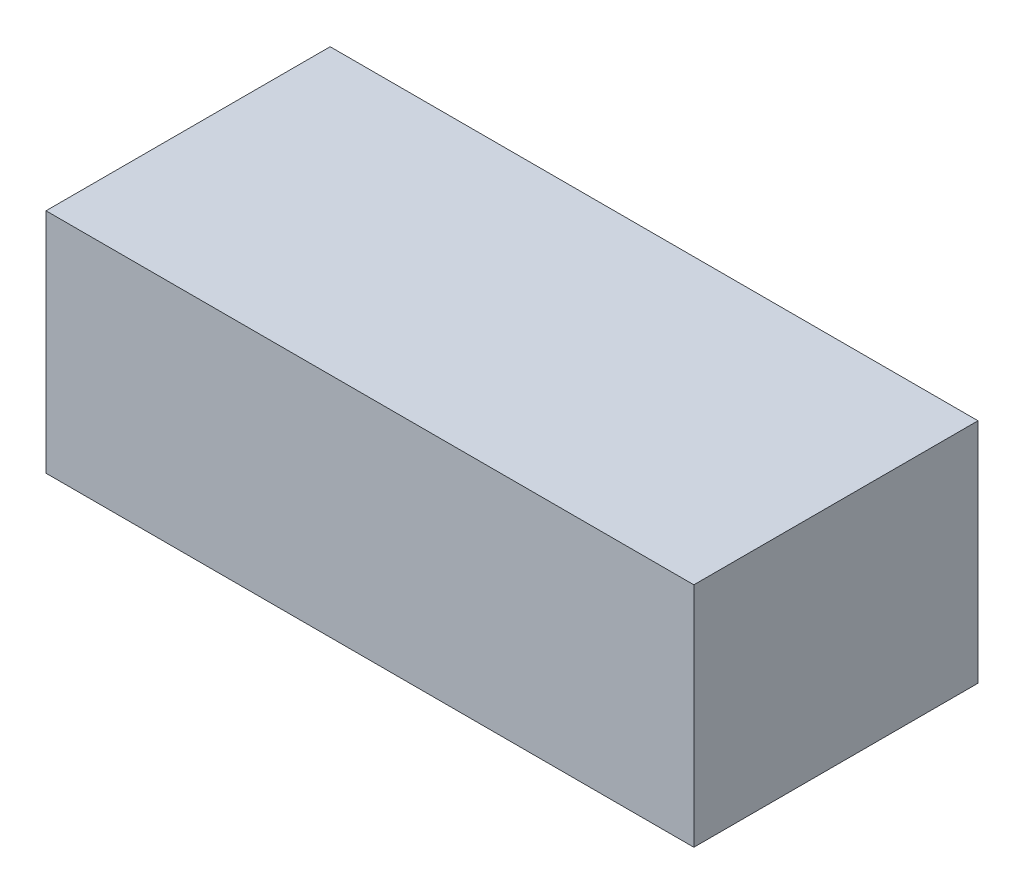
ISO-10303-21;
HEADER;
FILE_DESCRIPTION(('STEP AP214'),'2;1');
FILE_NAME('part.step','',(''),(''),'','','');
FILE_SCHEMA(('AUTOMOTIVE_DESIGN { 1 0 10303 214 1 1 1 1 }'));
ENDSEC;
DATA;
#1=APPLICATION_CONTEXT('core data for automotive mechanical design processes');
#2=APPLICATION_PROTOCOL_DEFINITION('international standard','automotive_design',2000,#1);
#3=PRODUCT_CONTEXT('',#1,'mechanical');
#4=PRODUCT('Part','Part','',(#3));
#5=PRODUCT_RELATED_PRODUCT_CATEGORY('part','',(#4));
#6=PRODUCT_DEFINITION_FORMATION('','',#4);
#7=PRODUCT_DEFINITION_CONTEXT('part definition',#1,'design');
#8=PRODUCT_DEFINITION('design','',#6,#7);
#9=PRODUCT_DEFINITION_SHAPE('','',#8);
#10=(LENGTH_UNIT() NAMED_UNIT(*) SI_UNIT(.MILLI.,.METRE.));
#11=(NAMED_UNIT(*) PLANE_ANGLE_UNIT() SI_UNIT($,.RADIAN.));
#12=(NAMED_UNIT(*) SI_UNIT($,.STERADIAN.) SOLID_ANGLE_UNIT());
#13=UNCERTAINTY_MEASURE_WITH_UNIT(LENGTH_MEASURE(1.E-05),#10,'distance_accuracy_value','');
#14=(GEOMETRIC_REPRESENTATION_CONTEXT(3) GLOBAL_UNCERTAINTY_ASSIGNED_CONTEXT((#13)) GLOBAL_UNIT_ASSIGNED_CONTEXT((#10,
#11,#12)) REPRESENTATION_CONTEXT('',''));
#15=CARTESIAN_POINT('',(0.,0.,0.));
#16=DIRECTION('',(0.,0.,1.));
#17=DIRECTION('',(1.,0.,0.));
#18=AXIS2_PLACEMENT_3D('',#15,#16,#17);
#19=CARTESIAN_POINT('',(28.5,20.,-12.5));
#20=DIRECTION('',(-1.,0.,0.));
#21=DIRECTION('',(0.,0.,1.));
#22=AXIS2_PLACEMENT_3D('',#19,#20,#21);
#23=PLANE('',#22);
#24=DIRECTION('',(0.,0.,-1.));
#25=VECTOR('',#24,1.);
#26=CARTESIAN_POINT('',(28.5,0.,-12.5));
#27=LINE('',#26,#25);
#28=CARTESIAN_POINT('',(28.5,0.,12.5));
#29=VERTEX_POINT('',#28);
#30=CARTESIAN_POINT('',(28.5,0.,-12.5));
#31=VERTEX_POINT('',#30);
#32=EDGE_CURVE('E113',#29,#31,#27,.T.);
#33=ORIENTED_EDGE('',*,*,#32,.T.);
#34=DIRECTION('',(0.,-1.,0.));
#35=VECTOR('',#34,1.);
#36=CARTESIAN_POINT('',(28.5,20.,-12.5));
#37=LINE('',#36,#35);
#38=CARTESIAN_POINT('',(28.5,20.,-12.5));
#39=VERTEX_POINT('',#38);
#40=EDGE_CURVE('E11',#39,#31,#37,.T.);
#41=ORIENTED_EDGE('',*,*,#40,.F.);
#42=DIRECTION('',(0.,0.,-1.));
#43=VECTOR('',#42,1.);
#44=CARTESIAN_POINT('',(28.5,20.,-12.5));
#45=LINE('',#44,#43);
#46=CARTESIAN_POINT('',(28.5,20.,12.5));
#47=VERTEX_POINT('',#46);
#48=EDGE_CURVE('E97',#47,#39,#45,.T.);
#49=ORIENTED_EDGE('',*,*,#48,.F.);
#50=DIRECTION('',(0.,-1.,0.));
#51=VECTOR('',#50,1.);
#52=CARTESIAN_POINT('',(28.5,20.,12.5));
#53=LINE('',#52,#51);
#54=EDGE_CURVE('E109',#47,#29,#53,.T.);
#55=ORIENTED_EDGE('',*,*,#54,.T.);
#56=EDGE_LOOP('',(#33,#41,#49,#55));
#57=FACE_BOUND('',#56,.T.);
#58=ADVANCED_FACE('F45',(#57),#23,.F.);
#59=CARTESIAN_POINT('',(-28.5,20.,-12.5));
#60=DIRECTION('',(0.,0.,1.));
#61=DIRECTION('',(1.,0.,0.));
#62=AXIS2_PLACEMENT_3D('',#59,#60,#61);
#63=PLANE('',#62);
#64=DIRECTION('',(-1.,0.,0.));
#65=VECTOR('',#64,1.);
#66=CARTESIAN_POINT('',(-28.5,0.,-12.5));
#67=LINE('',#66,#65);
#68=CARTESIAN_POINT('',(-28.5,0.,-12.5));
#69=VERTEX_POINT('',#68);
#70=EDGE_CURVE('E102',#31,#69,#67,.T.);
#71=ORIENTED_EDGE('',*,*,#70,.T.);
#72=DIRECTION('',(0.,-1.,0.));
#73=VECTOR('',#72,1.);
#74=CARTESIAN_POINT('',(-28.5,20.,-12.5));
#75=LINE('',#74,#73);
#76=CARTESIAN_POINT('',(-28.5,20.,-12.5));
#77=VERTEX_POINT('',#76);
#78=EDGE_CURVE('E54',#77,#69,#75,.T.);
#79=ORIENTED_EDGE('',*,*,#78,.F.);
#80=DIRECTION('',(-1.,0.,0.));
#81=VECTOR('',#80,1.);
#82=CARTESIAN_POINT('',(-28.5,20.,-12.5));
#83=LINE('',#82,#81);
#84=EDGE_CURVE('E92',#39,#77,#83,.T.);
#85=ORIENTED_EDGE('',*,*,#84,.F.);
#86=ORIENTED_EDGE('',*,*,#40,.T.);
#87=EDGE_LOOP('',(#71,#79,#85,#86));
#88=FACE_BOUND('',#87,.T.);
#89=ADVANCED_FACE('F101',(#88),#63,.F.);
#90=CARTESIAN_POINT('',(-28.5,20.,-12.5));
#91=DIRECTION('',(1.,0.,0.));
#92=DIRECTION('',(0.,0.,-1.));
#93=AXIS2_PLACEMENT_3D('',#90,#91,#92);
#94=PLANE('',#93);
#95=DIRECTION('',(0.,0.,1.));
#96=VECTOR('',#95,1.);
#97=CARTESIAN_POINT('',(-28.5,0.,-12.5));
#98=LINE('',#97,#96);
#99=CARTESIAN_POINT('',(-28.5,0.,12.5));
#100=VERTEX_POINT('',#99);
#101=EDGE_CURVE('E79',#69,#100,#98,.T.);
#102=ORIENTED_EDGE('',*,*,#101,.T.);
#103=DIRECTION('',(0.,-1.,0.));
#104=VECTOR('',#103,1.);
#105=CARTESIAN_POINT('',(-28.5,20.,12.5));
#106=LINE('',#105,#104);
#107=CARTESIAN_POINT('',(-28.5,20.,12.5));
#108=VERTEX_POINT('',#107);
#109=EDGE_CURVE('E104',#108,#100,#106,.T.);
#110=ORIENTED_EDGE('',*,*,#109,.F.);
#111=DIRECTION('',(0.,0.,1.));
#112=VECTOR('',#111,1.);
#113=CARTESIAN_POINT('',(-28.5,20.,-12.5));
#114=LINE('',#113,#112);
#115=EDGE_CURVE('E95',#77,#108,#114,.T.);
#116=ORIENTED_EDGE('',*,*,#115,.F.);
#117=ORIENTED_EDGE('',*,*,#78,.T.);
#118=EDGE_LOOP('',(#102,#110,#116,#117));
#119=FACE_BOUND('',#118,.T.);
#120=ADVANCED_FACE('F105',(#119),#94,.F.);
#121=CARTESIAN_POINT('',(-28.5,20.,12.5));
#122=DIRECTION('',(0.,0.,-1.));
#123=DIRECTION('',(-1.,0.,0.));
#124=AXIS2_PLACEMENT_3D('',#121,#122,#123);
#125=PLANE('',#124);
#126=DIRECTION('',(1.,0.,0.));
#127=VECTOR('',#126,1.);
#128=CARTESIAN_POINT('',(-28.5,0.,12.5));
#129=LINE('',#128,#127);
#130=EDGE_CURVE('E85',#100,#29,#129,.T.);
#131=ORIENTED_EDGE('',*,*,#130,.T.);
#132=ORIENTED_EDGE('',*,*,#54,.F.);
#133=DIRECTION('',(1.,0.,0.));
#134=VECTOR('',#133,1.);
#135=CARTESIAN_POINT('',(-28.5,20.,12.5));
#136=LINE('',#135,#134);
#137=EDGE_CURVE('E62',#108,#47,#136,.T.);
#138=ORIENTED_EDGE('',*,*,#137,.F.);
#139=ORIENTED_EDGE('',*,*,#109,.T.);
#140=EDGE_LOOP('',(#131,#132,#138,#139));
#141=FACE_BOUND('',#140,.T.);
#142=ADVANCED_FACE('F126',(#141),#125,.F.);
#143=CARTESIAN_POINT('',(0.,20.,0.));
#144=DIRECTION('',(0.,1.,0.));
#145=DIRECTION('',(0.,0.,1.));
#146=AXIS2_PLACEMENT_3D('',#143,#144,#145);
#147=PLANE('',#146);
#148=ORIENTED_EDGE('',*,*,#48,.T.);
#149=ORIENTED_EDGE('',*,*,#84,.T.);
#150=ORIENTED_EDGE('',*,*,#115,.T.);
#151=ORIENTED_EDGE('',*,*,#137,.T.);
#152=EDGE_LOOP('',(#148,#149,#150,#151));
#153=FACE_BOUND('',#152,.T.);
#154=ADVANCED_FACE('F93',(#153),#147,.T.);
#155=CARTESIAN_POINT('',(0.,0.,0.));
#156=DIRECTION('',(0.,1.,0.));
#157=DIRECTION('',(0.,0.,1.));
#158=AXIS2_PLACEMENT_3D('',#155,#156,#157);
#159=PLANE('',#158);
#160=ORIENTED_EDGE('',*,*,#32,.F.);
#161=ORIENTED_EDGE('',*,*,#130,.F.);
#162=ORIENTED_EDGE('',*,*,#101,.F.);
#163=ORIENTED_EDGE('',*,*,#70,.F.);
#164=EDGE_LOOP('',(#160,#161,#162,#163));
#165=FACE_BOUND('',#164,.T.);
#166=ADVANCED_FACE('F129',(#165),#159,.F.);
#167=CLOSED_SHELL('',(#58,#89,#120,#142,#154,#166));
#168=MANIFOLD_SOLID_BREP('B2',#167);
#169=ADVANCED_BREP_SHAPE_REPRESENTATION('',(#18,#168),#14);
#170=SHAPE_DEFINITION_REPRESENTATION(#9,#169);
ENDSEC;
END-ISO-10303-21;
